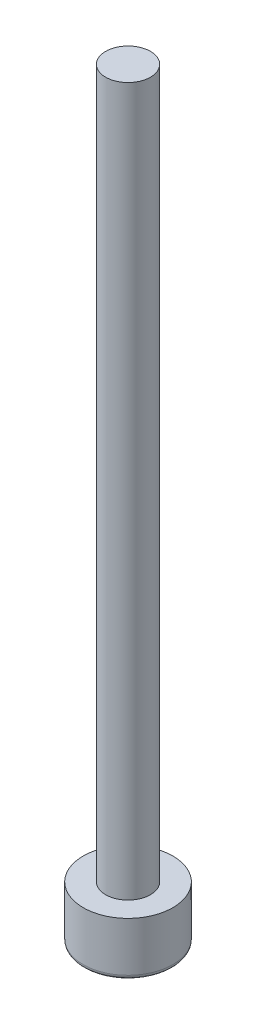
ISO-10303-21;
HEADER;
FILE_DESCRIPTION(('STEP AP214'),'2;1');
FILE_NAME('part.step','',(''),(''),'','','');
FILE_SCHEMA(('AUTOMOTIVE_DESIGN { 1 0 10303 214 1 1 1 1 }'));
ENDSEC;
DATA;
#1=APPLICATION_CONTEXT('core data for automotive mechanical design processes');
#2=APPLICATION_PROTOCOL_DEFINITION('international standard','automotive_design',2000,#1);
#3=PRODUCT_CONTEXT('',#1,'mechanical');
#4=PRODUCT('Part','Part','',(#3));
#5=PRODUCT_RELATED_PRODUCT_CATEGORY('part','',(#4));
#6=PRODUCT_DEFINITION_FORMATION('','',#4);
#7=PRODUCT_DEFINITION_CONTEXT('part definition',#1,'design');
#8=PRODUCT_DEFINITION('design','',#6,#7);
#9=PRODUCT_DEFINITION_SHAPE('','',#8);
#10=(LENGTH_UNIT() NAMED_UNIT(*) SI_UNIT(.MILLI.,.METRE.));
#11=(NAMED_UNIT(*) PLANE_ANGLE_UNIT() SI_UNIT($,.RADIAN.));
#12=(NAMED_UNIT(*) SI_UNIT($,.STERADIAN.) SOLID_ANGLE_UNIT());
#13=UNCERTAINTY_MEASURE_WITH_UNIT(LENGTH_MEASURE(1.E-05),#10,'distance_accuracy_value','');
#14=(GEOMETRIC_REPRESENTATION_CONTEXT(3) GLOBAL_UNCERTAINTY_ASSIGNED_CONTEXT((#13)) GLOBAL_UNIT_ASSIGNED_CONTEXT((#10,
#11,#12)) REPRESENTATION_CONTEXT('',''));
#15=CARTESIAN_POINT('',(0.,0.,0.));
#16=DIRECTION('',(0.,0.,1.));
#17=DIRECTION('',(1.,0.,0.));
#18=AXIS2_PLACEMENT_3D('',#15,#16,#17);
#19=CARTESIAN_POINT('',(0.,170.,0.));
#20=DIRECTION('',(0.,1.,0.));
#21=DIRECTION('',(0.,0.,1.));
#22=AXIS2_PLACEMENT_3D('',#19,#20,#21);
#23=PLANE('',#22);
#24=CARTESIAN_POINT('',(0.,170.,0.));
#25=DIRECTION('',(0.,-1.,0.));
#26=DIRECTION('',(0.,0.,-1.));
#27=AXIS2_PLACEMENT_3D('',#24,#25,#26);
#28=CIRCLE('',#27,5.);
#29=CARTESIAN_POINT('',(0.,170.,-5.));
#30=VERTEX_POINT('',#29);
#31=EDGE_CURVE('E44',#30,#30,#28,.T.);
#32=ORIENTED_EDGE('',*,*,#31,.F.);
#33=EDGE_LOOP('',(#32));
#34=FACE_BOUND('',#33,.T.);
#35=ADVANCED_FACE('F33',(#34),#23,.T.);
#36=CARTESIAN_POINT('',(0.,0.,0.));
#37=DIRECTION('',(0.,-1.,0.));
#38=DIRECTION('',(0.,0.,-1.));
#39=AXIS2_PLACEMENT_3D('',#36,#37,#38);
#40=CYLINDRICAL_SURFACE('',#39,5.);
#41=ORIENTED_EDGE('',*,*,#31,.T.);
#42=EDGE_LOOP('',(#41));
#43=FACE_BOUND('',#42,.T.);
#44=CARTESIAN_POINT('',(0.,12.,0.));
#45=DIRECTION('',(0.,-1.,0.));
#46=DIRECTION('',(0.,0.,-1.));
#47=AXIS2_PLACEMENT_3D('',#44,#45,#46);
#48=CIRCLE('',#47,5.);
#49=CARTESIAN_POINT('',(0.,12.,-5.));
#50=VERTEX_POINT('',#49);
#51=EDGE_CURVE('E48',#50,#50,#48,.T.);
#52=ORIENTED_EDGE('',*,*,#51,.F.);
#53=EDGE_LOOP('',(#52));
#54=FACE_BOUND('',#53,.T.);
#55=ADVANCED_FACE('F61',(#43,#54),#40,.T.);
#56=CARTESIAN_POINT('',(5.,12.,0.));
#57=DIRECTION('',(0.,1.,0.));
#58=DIRECTION('',(0.,0.,1.));
#59=AXIS2_PLACEMENT_3D('',#56,#57,#58);
#60=PLANE('',#59);
#61=ORIENTED_EDGE('',*,*,#51,.T.);
#62=EDGE_LOOP('',(#61));
#63=FACE_BOUND('',#62,.T.);
#64=CARTESIAN_POINT('',(0.,12.,0.));
#65=DIRECTION('',(0.,-1.,0.));
#66=DIRECTION('',(0.,0.,-1.));
#67=AXIS2_PLACEMENT_3D('',#64,#65,#66);
#68=CIRCLE('',#67,10.);
#69=CARTESIAN_POINT('',(0.,12.,-10.));
#70=VERTEX_POINT('',#69);
#71=EDGE_CURVE('E53',#70,#70,#68,.T.);
#72=ORIENTED_EDGE('',*,*,#71,.F.);
#73=EDGE_LOOP('',(#72));
#74=FACE_BOUND('',#73,.T.);
#75=ADVANCED_FACE('F59',(#63,#74),#60,.T.);
#76=CARTESIAN_POINT('',(0.,0.,0.));
#77=DIRECTION('',(0.,-1.,0.));
#78=DIRECTION('',(0.,0.,-1.));
#79=AXIS2_PLACEMENT_3D('',#76,#77,#78);
#80=CYLINDRICAL_SURFACE('',#79,10.);
#81=CARTESIAN_POINT('',(0.,1.,0.));
#82=DIRECTION('',(0.,-1.,0.));
#83=DIRECTION('',(0.,0.,-1.));
#84=AXIS2_PLACEMENT_3D('',#81,#82,#83);
#85=CIRCLE('',#84,10.);
#86=CARTESIAN_POINT('',(0.,1.,-10.));
#87=VERTEX_POINT('',#86);
#88=EDGE_CURVE('E10',#87,#87,#85,.F.);
#89=ORIENTED_EDGE('',*,*,#88,.T.);
#90=EDGE_LOOP('',(#89));
#91=FACE_BOUND('',#90,.T.);
#92=ORIENTED_EDGE('',*,*,#71,.T.);
#93=EDGE_LOOP('',(#92));
#94=FACE_BOUND('',#93,.T.);
#95=ADVANCED_FACE('F57',(#91,#94),#80,.T.);
#96=CARTESIAN_POINT('',(10.,0.,0.));
#97=DIRECTION('',(0.,-1.,0.));
#98=DIRECTION('',(0.,0.,-1.));
#99=AXIS2_PLACEMENT_3D('',#96,#97,#98);
#100=PLANE('',#99);
#101=CARTESIAN_POINT('',(0.,0.,0.));
#102=DIRECTION('',(0.,-1.,0.));
#103=DIRECTION('',(0.,0.,-1.));
#104=AXIS2_PLACEMENT_3D('',#101,#102,#103);
#105=CIRCLE('',#104,9.);
#106=CARTESIAN_POINT('',(0.,0.,-9.));
#107=VERTEX_POINT('',#106);
#108=EDGE_CURVE('E40',#107,#107,#105,.T.);
#109=ORIENTED_EDGE('',*,*,#108,.T.);
#110=EDGE_LOOP('',(#109));
#111=FACE_BOUND('',#110,.T.);
#112=ADVANCED_FACE('F68',(#111),#100,.T.);
#113=CARTESIAN_POINT('',(0.,1.,0.));
#114=DIRECTION('',(0.,-1.,0.));
#115=DIRECTION('',(0.,0.,-1.));
#116=AXIS2_PLACEMENT_3D('',#113,#114,#115);
#117=TOROIDAL_SURFACE('',#116,9.,1.);
#118=ORIENTED_EDGE('',*,*,#88,.F.);
#119=EDGE_LOOP('',(#118));
#120=FACE_BOUND('',#119,.T.);
#121=ORIENTED_EDGE('',*,*,#108,.F.);
#122=EDGE_LOOP('',(#121));
#123=FACE_BOUND('',#122,.T.);
#124=ADVANCED_FACE('F35',(#120,#123),#117,.T.);
#125=CLOSED_SHELL('',(#35,#55,#75,#95,#112,#124));
#126=MANIFOLD_SOLID_BREP('B2',#125);
#127=ADVANCED_BREP_SHAPE_REPRESENTATION('',(#18,#126),#14);
#128=SHAPE_DEFINITION_REPRESENTATION(#9,#127);
ENDSEC;
END-ISO-10303-21;
